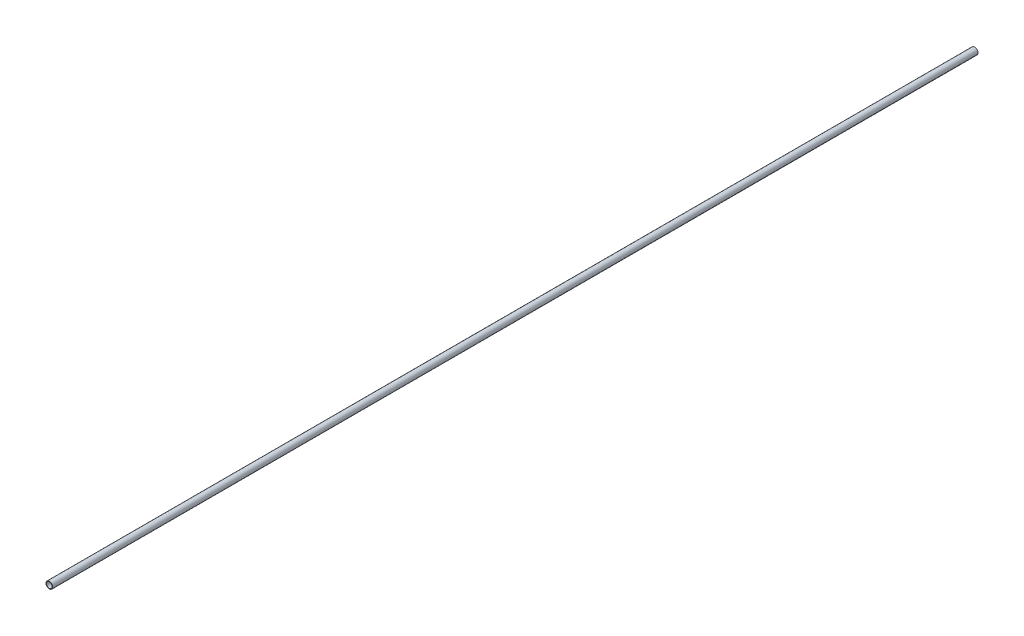
ISO-10303-21;
HEADER;
FILE_DESCRIPTION(('STEP AP214'),'2;1');
FILE_NAME('part.step','',(''),(''),'','','');
FILE_SCHEMA(('AUTOMOTIVE_DESIGN { 1 0 10303 214 1 1 1 1 }'));
ENDSEC;
DATA;
#1=APPLICATION_CONTEXT('core data for automotive mechanical design processes');
#2=APPLICATION_PROTOCOL_DEFINITION('international standard','automotive_design',2000,#1);
#3=PRODUCT_CONTEXT('',#1,'mechanical');
#4=PRODUCT('Part','Part','',(#3));
#5=PRODUCT_RELATED_PRODUCT_CATEGORY('part','',(#4));
#6=PRODUCT_DEFINITION_FORMATION('','',#4);
#7=PRODUCT_DEFINITION_CONTEXT('part definition',#1,'design');
#8=PRODUCT_DEFINITION('design','',#6,#7);
#9=PRODUCT_DEFINITION_SHAPE('','',#8);
#10=(LENGTH_UNIT() NAMED_UNIT(*) SI_UNIT(.MILLI.,.METRE.));
#11=(NAMED_UNIT(*) PLANE_ANGLE_UNIT() SI_UNIT($,.RADIAN.));
#12=(NAMED_UNIT(*) SI_UNIT($,.STERADIAN.) SOLID_ANGLE_UNIT());
#13=UNCERTAINTY_MEASURE_WITH_UNIT(LENGTH_MEASURE(1.E-05),#10,'distance_accuracy_value','');
#14=(GEOMETRIC_REPRESENTATION_CONTEXT(3) GLOBAL_UNCERTAINTY_ASSIGNED_CONTEXT((#13)) GLOBAL_UNIT_ASSIGNED_CONTEXT((#10,
#11,#12)) REPRESENTATION_CONTEXT('',''));
#15=CARTESIAN_POINT('',(0.,0.,0.));
#16=DIRECTION('',(0.,0.,1.));
#17=DIRECTION('',(1.,0.,0.));
#18=AXIS2_PLACEMENT_3D('',#15,#16,#17);
#19=CARTESIAN_POINT('',(0.,0.,10491.9868026709));
#20=DIRECTION('',(0.,0.,1.));
#21=DIRECTION('',(1.,0.,0.));
#22=AXIS2_PLACEMENT_3D('',#19,#20,#21);
#23=PLANE('',#22);
#24=CARTESIAN_POINT('',(0.,0.,10491.9868026709));
#25=DIRECTION('',(0.,0.,1.));
#26=DIRECTION('',(1.,0.,0.));
#27=AXIS2_PLACEMENT_3D('',#24,#25,#26);
#28=CIRCLE('',#27,38.1);
#29=CARTESIAN_POINT('',(38.1,0.,10491.9868026709));
#30=VERTEX_POINT('',#29);
#31=EDGE_CURVE('E10',#30,#30,#28,.T.);
#32=ORIENTED_EDGE('',*,*,#31,.T.);
#33=EDGE_LOOP('',(#32));
#34=FACE_BOUND('',#33,.T.);
#35=CARTESIAN_POINT('',(0.,0.,10491.9868026709));
#36=DIRECTION('',(0.,0.,1.));
#37=DIRECTION('',(1.,0.,0.));
#38=AXIS2_PLACEMENT_3D('',#35,#36,#37);
#39=CIRCLE('',#38,31.75);
#40=CARTESIAN_POINT('',(31.75,0.,10491.9868026709));
#41=VERTEX_POINT('',#40);
#42=EDGE_CURVE('E53',#41,#41,#39,.T.);
#43=ORIENTED_EDGE('',*,*,#42,.F.);
#44=EDGE_LOOP('',(#43));
#45=FACE_BOUND('',#44,.T.);
#46=ADVANCED_FACE('F43',(#34,#45),#23,.T.);
#47=CARTESIAN_POINT('',(0.,0.,0.));
#48=DIRECTION('',(0.,0.,1.));
#49=DIRECTION('',(1.,0.,0.));
#50=AXIS2_PLACEMENT_3D('',#47,#48,#49);
#51=PLANE('',#50);
#52=CARTESIAN_POINT('',(0.,0.,0.));
#53=DIRECTION('',(0.,0.,1.));
#54=DIRECTION('',(1.,0.,0.));
#55=AXIS2_PLACEMENT_3D('',#52,#53,#54);
#56=CIRCLE('',#55,38.1);
#57=CARTESIAN_POINT('',(38.1,0.,0.));
#58=VERTEX_POINT('',#57);
#59=EDGE_CURVE('E50',#58,#58,#56,.T.);
#60=ORIENTED_EDGE('',*,*,#59,.F.);
#61=EDGE_LOOP('',(#60));
#62=FACE_BOUND('',#61,.T.);
#63=CARTESIAN_POINT('',(0.,0.,0.));
#64=DIRECTION('',(0.,0.,1.));
#65=DIRECTION('',(1.,0.,0.));
#66=AXIS2_PLACEMENT_3D('',#63,#64,#65);
#67=CIRCLE('',#66,31.75);
#68=CARTESIAN_POINT('',(31.75,0.,0.));
#69=VERTEX_POINT('',#68);
#70=EDGE_CURVE('E57',#69,#69,#67,.T.);
#71=ORIENTED_EDGE('',*,*,#70,.T.);
#72=EDGE_LOOP('',(#71));
#73=FACE_BOUND('',#72,.T.);
#74=ADVANCED_FACE('F67',(#62,#73),#51,.F.);
#75=CARTESIAN_POINT('',(0.,0.,10491.9868026709));
#76=DIRECTION('',(0.,0.,-1.));
#77=DIRECTION('',(-1.,0.,0.));
#78=AXIS2_PLACEMENT_3D('',#75,#76,#77);
#79=CYLINDRICAL_SURFACE('',#78,38.1);
#80=ORIENTED_EDGE('',*,*,#31,.F.);
#81=EDGE_LOOP('',(#80));
#82=FACE_BOUND('',#81,.T.);
#83=ORIENTED_EDGE('',*,*,#59,.T.);
#84=EDGE_LOOP('',(#83));
#85=FACE_BOUND('',#84,.T.);
#86=ADVANCED_FACE('F44',(#82,#85),#79,.T.);
#87=CARTESIAN_POINT('',(0.,0.,10491.9868026709));
#88=DIRECTION('',(0.,0.,-1.));
#89=DIRECTION('',(-1.,0.,0.));
#90=AXIS2_PLACEMENT_3D('',#87,#88,#89);
#91=CYLINDRICAL_SURFACE('',#90,31.75);
#92=ORIENTED_EDGE('',*,*,#42,.T.);
#93=EDGE_LOOP('',(#92));
#94=FACE_BOUND('',#93,.T.);
#95=ORIENTED_EDGE('',*,*,#70,.F.);
#96=EDGE_LOOP('',(#95));
#97=FACE_BOUND('',#96,.T.);
#98=ADVANCED_FACE('F65',(#94,#97),#91,.F.);
#99=CLOSED_SHELL('',(#46,#74,#86,#98));
#100=MANIFOLD_SOLID_BREP('B2',#99);
#101=ADVANCED_BREP_SHAPE_REPRESENTATION('',(#18,#100),#14);
#102=SHAPE_DEFINITION_REPRESENTATION(#9,#101);
ENDSEC;
END-ISO-10303-21;
